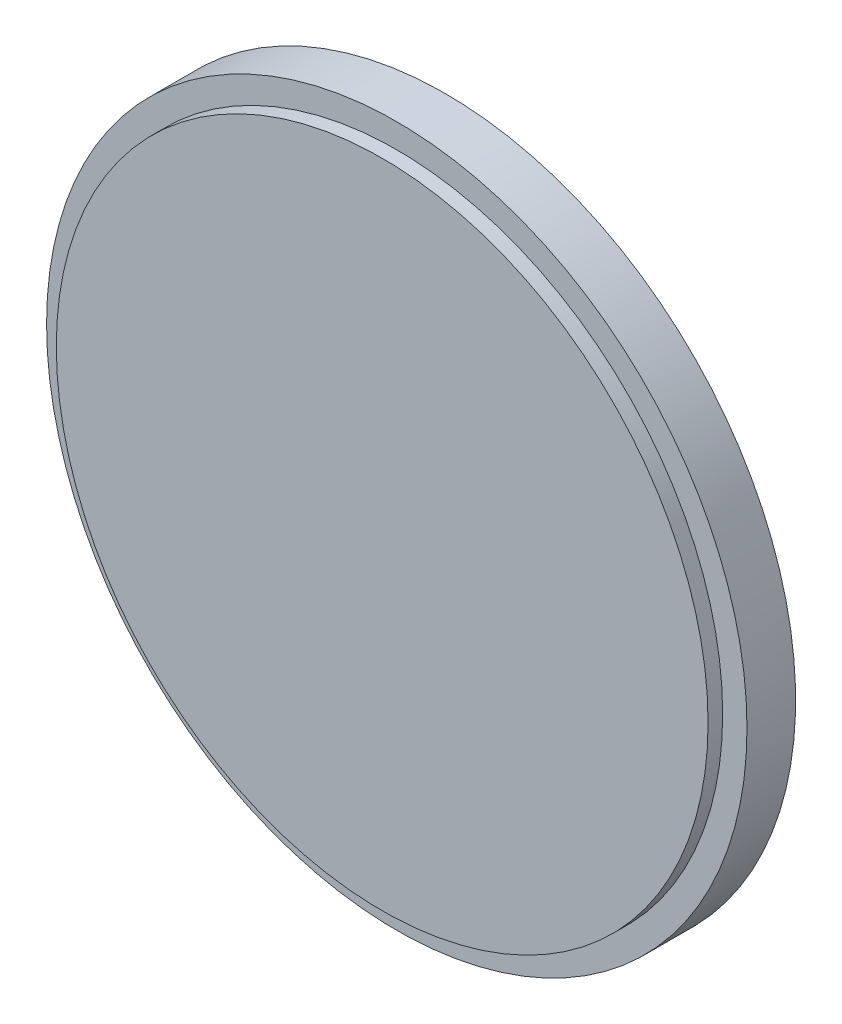
ISO-10303-21;
HEADER;
FILE_DESCRIPTION(('STEP AP214'),'2;1');
FILE_NAME('part.step','',(''),(''),'','','');
FILE_SCHEMA(('AUTOMOTIVE_DESIGN { 1 0 10303 214 1 1 1 1 }'));
ENDSEC;
DATA;
#1=APPLICATION_CONTEXT('core data for automotive mechanical design processes');
#2=APPLICATION_PROTOCOL_DEFINITION('international standard','automotive_design',2000,#1);
#3=PRODUCT_CONTEXT('',#1,'mechanical');
#4=PRODUCT('Part','Part','',(#3));
#5=PRODUCT_RELATED_PRODUCT_CATEGORY('part','',(#4));
#6=PRODUCT_DEFINITION_FORMATION('','',#4);
#7=PRODUCT_DEFINITION_CONTEXT('part definition',#1,'design');
#8=PRODUCT_DEFINITION('design','',#6,#7);
#9=PRODUCT_DEFINITION_SHAPE('','',#8);
#10=(LENGTH_UNIT() NAMED_UNIT(*) SI_UNIT(.MILLI.,.METRE.));
#11=(NAMED_UNIT(*) PLANE_ANGLE_UNIT() SI_UNIT($,.RADIAN.));
#12=(NAMED_UNIT(*) SI_UNIT($,.STERADIAN.) SOLID_ANGLE_UNIT());
#13=UNCERTAINTY_MEASURE_WITH_UNIT(LENGTH_MEASURE(1.E-05),#10,'distance_accuracy_value','');
#14=(GEOMETRIC_REPRESENTATION_CONTEXT(3) GLOBAL_UNCERTAINTY_ASSIGNED_CONTEXT((#13)) GLOBAL_UNIT_ASSIGNED_CONTEXT((#10,
#11,#12)) REPRESENTATION_CONTEXT('',''));
#15=CARTESIAN_POINT('',(0.,0.,0.));
#16=DIRECTION('',(0.,0.,1.));
#17=DIRECTION('',(1.,0.,0.));
#18=AXIS2_PLACEMENT_3D('',#15,#16,#17);
#19=CARTESIAN_POINT('',(0.,0.,0.));
#20=DIRECTION('',(0.,0.,-1.));
#21=DIRECTION('',(-1.,0.,0.));
#22=AXIS2_PLACEMENT_3D('',#19,#20,#21);
#23=CYLINDRICAL_SURFACE('',#22,1.65);
#24=DIRECTION('',(0.,0.,-1.));
#25=VECTOR('',#24,1.);
#26=CARTESIAN_POINT('',(-1.22983738762488,1.1,0.));
#27=LINE('',#26,#25);
#28=CARTESIAN_POINT('',(-1.22983738762488,1.1,-8.67414363469547));
#29=VERTEX_POINT('',#28);
#30=CARTESIAN_POINT('',(-1.22983738762488,1.1,-11.));
#31=VERTEX_POINT('',#30);
#32=EDGE_CURVE('E93',#29,#31,#27,.T.);
#33=ORIENTED_EDGE('',*,*,#32,.F.);
#34=CARTESIAN_POINT('',(-1.22983738762488,1.1,-8.67414363469547));
#35=CARTESIAN_POINT('',(-1.25972267770271,1.06657468285451,-8.65400140403858));
#36=CARTESIAN_POINT('',(-1.2882164500901,1.03198817515102,-8.63371639752812));
#37=CARTESIAN_POINT('',(-1.34237621084832,0.960493262433783,-8.59331950486891));
#38=CARTESIAN_POINT('',(-1.3680386895312,0.923582062762849,-8.57320786145536));
#39=CARTESIAN_POINT('',(-1.41674056297546,0.84701241880221,-8.5334040492105));
#40=CARTESIAN_POINT('',(-1.43974034049799,0.807323863660248,-8.51372107206718));
#41=CARTESIAN_POINT('',(-1.48256092162577,0.725697771452141,-8.47567938063038));
#42=CARTESIAN_POINT('',(-1.50238345304045,0.683761473396036,-8.45731994959245));
#43=CARTESIAN_POINT('',(-1.5472691760861,0.577232965481057,-8.41439211184499));
#44=CARTESIAN_POINT('',(-1.57037612270089,0.511307129973477,-8.39099456375916));
#45=CARTESIAN_POINT('',(-1.60828546831877,0.37532171075534,-8.35139108135665));
#46=CARTESIAN_POINT('',(-1.62312780280254,0.305283845813563,-8.33515064401284));
#47=CARTESIAN_POINT('',(-1.64372395591521,0.16127800192553,-8.31233643182032));
#48=CARTESIAN_POINT('',(-1.64935750847357,0.0872708555073534,-8.30589064973981));
#49=CARTESIAN_POINT('',(-1.65053754719034,-0.0609531668715777,-8.30455478391828));
#50=CARTESIAN_POINT('',(-1.64608287017167,-0.135170066031502,-8.30966603270764));
#51=CARTESIAN_POINT('',(-1.62904834866139,-0.269354255413211,-8.32862042054279));
#52=CARTESIAN_POINT('',(-1.61785207405163,-0.329731150995088,-8.34096871124797));
#53=CARTESIAN_POINT('',(-1.58930666728508,-0.447528660137509,-8.37136141854806));
#54=CARTESIAN_POINT('',(-1.57195078616389,-0.504945951570416,-8.38941208073063));
#55=CARTESIAN_POINT('',(-1.51981112380505,-0.649282675864939,-8.44128661621104));
#56=CARTESIAN_POINT('',(-1.48078961155974,-0.733582130426046,-8.47812756257792));
#57=CARTESIAN_POINT('',(-1.39037928017929,-0.893190532483568,-8.55599740198226));
#58=CARTESIAN_POINT('',(-1.33896184092909,-0.968478062021212,-8.59703585824725));
#59=CARTESIAN_POINT('',(-1.22287267734106,-1.1116685700627,-8.68025476696594));
#60=CARTESIAN_POINT('',(-1.15786677869635,-1.17930197847097,-8.72243464117089));
#61=CARTESIAN_POINT('',(-1.01606582055608,-1.3034418921011,-8.80300874565532));
#62=CARTESIAN_POINT('',(-0.939290596963742,-1.3599667604018,-8.84140917021824));
#63=CARTESIAN_POINT('',(-0.789073764155508,-1.45126789157716,-8.90494694511223));
#64=CARTESIAN_POINT('',(-0.717383559064625,-1.48811768180286,-8.93122942565062));
#65=CARTESIAN_POINT('',(-0.567505115457208,-1.55146470867889,-8.97698410392863));
#66=CARTESIAN_POINT('',(-0.489320686427698,-1.57796796327856,-8.99646025979951));
#67=CARTESIAN_POINT('',(-0.327709962082995,-1.61929041342061,-9.02701763496249));
#68=CARTESIAN_POINT('',(-0.244251987928246,-1.634029940681,-9.03804159343875));
#69=CARTESIAN_POINT('',(-0.0753585849575415,-1.65045618297154,-9.05033499698802));
#70=CARTESIAN_POINT('',(0.0100756992051538,-1.6521502728514,-9.05160995336631));
#71=CARTESIAN_POINT('',(0.170253339593169,-1.64293207202227,-9.04470290043584));
#72=CARTESIAN_POINT('',(0.245128040339948,-1.63340221205291,-9.03755790250606));
#73=CARTESIAN_POINT('',(0.391879942106289,-1.60453244308618,-9.01608664328517));
#74=CARTESIAN_POINT('',(0.463756612429009,-1.5851908051639,-9.00175911637209));
#75=CARTESIAN_POINT('',(0.604442375314429,-1.53714066152403,-8.96660751097491));
#76=CARTESIAN_POINT('',(0.673149271858587,-1.50823555407053,-8.94564751727729));
#77=CARTESIAN_POINT('',(0.804690367902077,-1.44235591231456,-8.8987450801489));
#78=CARTESIAN_POINT('',(0.867523630455517,-1.40538009372112,-8.87280184381444));
#79=CARTESIAN_POINT('',(0.996309669760407,-1.31790100166509,-8.81295222346145));
#80=CARTESIAN_POINT('',(1.06114856394579,-1.26617947296784,-8.77843597356108));
#81=CARTESIAN_POINT('',(1.18180746475075,-1.15438829016984,-8.70695017555489));
#82=CARTESIAN_POINT('',(1.23760957960267,-1.09430250259961,-8.66997596016618));
#83=CARTESIAN_POINT('',(1.34973908910441,-0.954083951537922,-8.58892434363585));
#84=CARTESIAN_POINT('',(1.4040577372899,-0.872325096744643,-8.54486408417523));
#85=CARTESIAN_POINT('',(1.4981930779484,-0.698324563643964,-8.46224043130541));
#86=CARTESIAN_POINT('',(1.53804158223777,-0.606106472827377,-8.42366509468487));
#87=CARTESIAN_POINT('',(1.58933503393235,-0.447914995946644,-8.37145604288562));
#88=CARTESIAN_POINT('',(1.60583285811042,-0.384899799349373,-8.35387870733763));
#89=CARTESIAN_POINT('',(1.63136286756014,-0.255852810868967,-8.32614877726118));
#90=CARTESIAN_POINT('',(1.64041249718908,-0.189828452047195,-8.31597884039241));
#91=CARTESIAN_POINT('',(1.65042666865869,-0.0558902341369621,-8.30470219606004));
#92=CARTESIAN_POINT('',(1.65133479317434,0.0120335428020966,-8.30365873256452));
#93=CARTESIAN_POINT('',(1.64483217516017,0.146973788300026,-8.31100819652258));
#94=CARTESIAN_POINT('',(1.63741520623648,0.213989539779551,-8.31940818680678));
#95=CARTESIAN_POINT('',(1.61309135588696,0.355501334757847,-8.34609535114535));
#96=CARTESIAN_POINT('',(1.5948693685621,0.429504639559172,-8.3657358701901));
#97=CARTESIAN_POINT('',(1.5493396887642,0.572468262653248,-8.41224225544382));
#98=CARTESIAN_POINT('',(1.52199180907575,0.641404599646636,-8.43913997769595));
#99=CARTESIAN_POINT('',(1.45611538254922,0.780189447058983,-8.49982507259302));
#100=CARTESIAN_POINT('',(1.41674853168308,0.849453821409272,-8.53403074792977));
#101=CARTESIAN_POINT('',(1.35122656450678,0.947741528003057,-8.58636481834102));
#102=CARTESIAN_POINT('',(1.32844703529147,0.979413503045018,-8.60388338383029));
#103=CARTESIAN_POINT('',(1.28074395596679,1.04101278301063,-8.63901407129565));
#104=CARTESIAN_POINT('',(1.25582154643641,1.0709410020153,-8.65662613887704));
#105=CARTESIAN_POINT('',(1.22983738762488,1.1,-8.67414363469547));
#106=B_SPLINE_CURVE_WITH_KNOTS('',3,(#34,#35,#36,#37,#38,#39,#40,#41,#42,#43,#44,#45,#46,#47,
#48,#49,#50,#51,#52,#53,#54,#55,#56,#57,#58,#59,#60,#61,#62,#63,#64,#65,#66,#67,#68,#69,#70,#71,
#72,#73,#74,#75,#76,#77,#78,#79,#80,#81,#82,#83,#84,#85,#86,#87,#88,#89,#90,#91,#92,#93,#94,#95,
#96,#97,#98,#99,#100,#101,#102,#103,#104,#105),.UNSPECIFIED.,.F.,.F.,(4,2,2,2,2,2,2,2,2,2,2,2,2,
2,2,2,2,2,2,2,2,2,2,2,2,2,2,2,2,2,2,2,2,2,2,4),(0.,0.147430706747664,0.29504216335986,
0.444625367837822,0.594126949863428,0.81434501708278,1.03348952225696,1.25547381549451,
1.47748370491671,1.66468198055187,1.85208600226789,2.15025056286029,2.44911024165853,
2.75643509723401,3.06324757244658,3.31658284014988,3.56977053784193,3.82465870133456,
4.07940276080496,4.30578700645853,4.53221115694737,4.76361376718509,4.99505322736367,
5.26358388817572,5.53263987471877,5.85402604937325,6.17470133429575,6.37639100175707,
6.57760693832056,6.780216150931,6.98297699737486,7.21779837480066,7.45366777754985,
7.71286594762324,7.84109114847913,7.96924851718071),.UNSPECIFIED.);
#107=CARTESIAN_POINT('',(1.22983738762488,1.1,-8.67414363469547));
#108=VERTEX_POINT('',#107);
#109=EDGE_CURVE('E53',#29,#108,#106,.T.);
#110=ORIENTED_EDGE('',*,*,#109,.T.);
#111=DIRECTION('',(0.,0.,-1.));
#112=VECTOR('',#111,1.);
#113=CARTESIAN_POINT('',(1.22983738762488,1.1,0.));
#114=LINE('',#113,#112);
#115=CARTESIAN_POINT('',(1.22983738762488,1.1,-11.));
#116=VERTEX_POINT('',#115);
#117=EDGE_CURVE('E92',#108,#116,#114,.T.);
#118=ORIENTED_EDGE('',*,*,#117,.T.);
#119=CARTESIAN_POINT('',(0.,0.,-11.));
#120=DIRECTION('',(0.,0.,-1.));
#121=DIRECTION('',(-1.,0.,0.));
#122=AXIS2_PLACEMENT_3D('',#119,#120,#121);
#123=CIRCLE('',#122,1.65);
#124=EDGE_CURVE('E253',#116,#31,#123,.T.);
#125=ORIENTED_EDGE('',*,*,#124,.T.);
#126=EDGE_LOOP('',(#33,#110,#118,#125));
#127=FACE_BOUND('',#126,.T.);
#128=ADVANCED_FACE('F39',(#127),#23,.F.);
#129=CARTESIAN_POINT('',(1.22983738762488,1.1,0.));
#130=DIRECTION('',(0.,1.,0.));
#131=DIRECTION('',(0.,0.,1.));
#132=AXIS2_PLACEMENT_3D('',#129,#130,#131);
#133=PLANE('',#132);
#134=ORIENTED_EDGE('',*,*,#117,.F.);
#135=CARTESIAN_POINT('',(0.,1.1,-6.85));
#136=DIRECTION('',(0.,1.,0.));
#137=DIRECTION('',(0.,0.,1.));
#138=AXIS2_PLACEMENT_3D('',#135,#136,#137);
#139=CIRCLE('',#138,2.2);
#140=EDGE_CURVE('E11',#108,#29,#139,.T.);
#141=ORIENTED_EDGE('',*,*,#140,.T.);
#142=ORIENTED_EDGE('',*,*,#32,.T.);
#143=DIRECTION('',(1.,0.,0.));
#144=VECTOR('',#143,1.);
#145=CARTESIAN_POINT('',(1.22983738762488,1.1,-11.));
#146=LINE('',#145,#144);
#147=EDGE_CURVE('E255',#31,#116,#146,.T.);
#148=ORIENTED_EDGE('',*,*,#147,.T.);
#149=EDGE_LOOP('',(#134,#141,#142,#148));
#150=FACE_BOUND('',#149,.T.);
#151=ADVANCED_FACE('F151',(#150),#133,.F.);
#152=CARTESIAN_POINT('',(0.,0.,1.5));
#153=DIRECTION('',(0.,0.,-1.));
#154=DIRECTION('',(-1.,0.,0.));
#155=AXIS2_PLACEMENT_3D('',#152,#153,#154);
#156=PLANE('',#155);
#157=CARTESIAN_POINT('',(0.,0.,1.5));
#158=DIRECTION('',(0.,0.,-1.));
#159=DIRECTION('',(-1.,0.,0.));
#160=AXIS2_PLACEMENT_3D('',#157,#158,#159);
#161=CIRCLE('',#160,33.5);
#162=CARTESIAN_POINT('',(-33.5,0.,1.5));
#163=VERTEX_POINT('',#162);
#164=EDGE_CURVE('E111',#163,#163,#161,.T.);
#165=ORIENTED_EDGE('',*,*,#164,.F.);
#166=EDGE_LOOP('',(#165));
#167=FACE_BOUND('',#166,.T.);
#168=CARTESIAN_POINT('',(0.,0.,1.5));
#169=DIRECTION('',(0.,0.,-1.));
#170=DIRECTION('',(-1.,0.,0.));
#171=AXIS2_PLACEMENT_3D('',#168,#169,#170);
#172=CIRCLE('',#171,36.);
#173=CARTESIAN_POINT('',(-36.,0.,1.5));
#174=VERTEX_POINT('',#173);
#175=EDGE_CURVE('E98',#174,#174,#172,.T.);
#176=ORIENTED_EDGE('',*,*,#175,.T.);
#177=EDGE_LOOP('',(#176));
#178=FACE_BOUND('',#177,.T.);
#179=ADVANCED_FACE('F158',(#167,#178),#156,.T.);
#180=CARTESIAN_POINT('',(0.,0.,0.));
#181=DIRECTION('',(0.,0.,1.));
#182=DIRECTION('',(1.,0.,0.));
#183=AXIS2_PLACEMENT_3D('',#180,#181,#182);
#184=PLANE('',#183);
#185=CARTESIAN_POINT('',(0.,0.,0.));
#186=DIRECTION('',(0.,0.,1.));
#187=DIRECTION('',(1.,0.,0.));
#188=AXIS2_PLACEMENT_3D('',#185,#186,#187);
#189=CIRCLE('',#188,32.5);
#190=CARTESIAN_POINT('',(32.5,0.,0.));
#191=VERTEX_POINT('',#190);
#192=EDGE_CURVE('E125',#191,#191,#189,.T.);
#193=ORIENTED_EDGE('',*,*,#192,.T.);
#194=EDGE_LOOP('',(#193));
#195=FACE_BOUND('',#194,.T.);
#196=CARTESIAN_POINT('',(0.,0.,0.));
#197=DIRECTION('',(0.,0.,-1.));
#198=DIRECTION('',(-1.,0.,0.));
#199=AXIS2_PLACEMENT_3D('',#196,#197,#198);
#200=CIRCLE('',#199,33.5);
#201=CARTESIAN_POINT('',(-33.5,0.,0.));
#202=VERTEX_POINT('',#201);
#203=EDGE_CURVE('E110',#202,#202,#200,.T.);
#204=ORIENTED_EDGE('',*,*,#203,.T.);
#205=EDGE_LOOP('',(#204));
#206=FACE_BOUND('',#205,.T.);
#207=ADVANCED_FACE('F41',(#195,#206),#184,.F.);
#208=CARTESIAN_POINT('',(0.,0.,8.));
#209=DIRECTION('',(0.,0.,-1.));
#210=DIRECTION('',(-1.,0.,0.));
#211=AXIS2_PLACEMENT_3D('',#208,#209,#210);
#212=CYLINDRICAL_SURFACE('',#211,32.5);
#213=ORIENTED_EDGE('',*,*,#192,.F.);
#214=EDGE_LOOP('',(#213));
#215=FACE_BOUND('',#214,.T.);
#216=CARTESIAN_POINT('',(0.,0.,5.));
#217=DIRECTION('',(0.,0.,1.));
#218=DIRECTION('',(1.,0.,0.));
#219=AXIS2_PLACEMENT_3D('',#216,#217,#218);
#220=CIRCLE('',#219,32.5);
#221=CARTESIAN_POINT('',(32.5,0.,5.));
#222=VERTEX_POINT('',#221);
#223=EDGE_CURVE('E120',#222,#222,#220,.T.);
#224=ORIENTED_EDGE('',*,*,#223,.T.);
#225=EDGE_LOOP('',(#224));
#226=FACE_BOUND('',#225,.T.);
#227=ADVANCED_FACE('F224',(#215,#226),#212,.F.);
#228=CARTESIAN_POINT('',(0.,0.,5.));
#229=DIRECTION('',(0.,0.,1.));
#230=DIRECTION('',(1.,0.,0.));
#231=AXIS2_PLACEMENT_3D('',#228,#229,#230);
#232=PLANE('',#231);
#233=CARTESIAN_POINT('',(0.,0.,5.));
#234=DIRECTION('',(0.,0.,1.));
#235=DIRECTION('',(1.,0.,0.));
#236=AXIS2_PLACEMENT_3D('',#233,#234,#235);
#237=CIRCLE('',#236,10.);
#238=CARTESIAN_POINT('',(10.,0.,5.));
#239=VERTEX_POINT('',#238);
#240=EDGE_CURVE('E128',#239,#239,#237,.F.);
#241=ORIENTED_EDGE('',*,*,#240,.F.);
#242=EDGE_LOOP('',(#241));
#243=FACE_BOUND('',#242,.T.);
#244=ORIENTED_EDGE('',*,*,#223,.F.);
#245=EDGE_LOOP('',(#244));
#246=FACE_BOUND('',#245,.T.);
#247=ADVANCED_FACE('F209',(#243,#246),#232,.F.);
#248=CARTESIAN_POINT('',(0.,0.,1.5));
#249=DIRECTION('',(0.,0.,-1.));
#250=DIRECTION('',(-1.,0.,0.));
#251=AXIS2_PLACEMENT_3D('',#248,#249,#250);
#252=CYLINDRICAL_SURFACE('',#251,33.5);
#253=ORIENTED_EDGE('',*,*,#164,.T.);
#254=EDGE_LOOP('',(#253));
#255=FACE_BOUND('',#254,.T.);
#256=ORIENTED_EDGE('',*,*,#203,.F.);
#257=EDGE_LOOP('',(#256));
#258=FACE_BOUND('',#257,.T.);
#259=ADVANCED_FACE('F204',(#255,#258),#252,.T.);
#260=CARTESIAN_POINT('',(0.,0.,-11.));
#261=DIRECTION('',(0.,0.,1.));
#262=DIRECTION('',(1.,0.,0.));
#263=AXIS2_PLACEMENT_3D('',#260,#261,#262);
#264=CYLINDRICAL_SURFACE('',#263,10.);
#265=CARTESIAN_POINT('',(-2.2,-9.75499871860576,-6.85));
#266=CARTESIAN_POINT('',(-2.19999582985001,-9.75500118343098,-6.72804035884628));
#267=CARTESIAN_POINT('',(-2.18982403731247,-9.75731079100817,-6.60603075615576));
#268=CARTESIAN_POINT('',(-2.14945092595785,-9.76628244309111,-6.36548258057534));
#269=CARTESIAN_POINT('',(-2.11923523542218,-9.77294761053513,-6.24694656201175));
#270=CARTESIAN_POINT('',(-2.03977285771041,-9.78983981120235,-6.01685996121709));
#271=CARTESIAN_POINT('',(-1.9905471918907,-9.80006290881353,-5.90530182058323));
#272=CARTESIAN_POINT('',(-1.87452251455576,-9.82291434151705,-5.69202460414284));
#273=CARTESIAN_POINT('',(-1.80772382176928,-9.83554263298433,-5.59030534993039));
#274=CARTESIAN_POINT('',(-1.65723245142519,-9.8620226708364,-5.39785367898436));
#275=CARTESIAN_POINT('',(-1.57329618650844,-9.875890221968,-5.30731388132283));
#276=CARTESIAN_POINT('',(-1.3914381089065,-9.90314793868655,-5.14147856488675));
#277=CARTESIAN_POINT('',(-1.293515202231,-9.91653806682853,-5.06618423967896));
#278=CARTESIAN_POINT('',(-1.08517100314848,-9.94150445503394,-4.93221427132276));
#279=CARTESIAN_POINT('',(-0.974627774835852,-9.95305989181124,-4.87372404304363));
#280=CARTESIAN_POINT('',(-0.744984431647961,-9.97287631874014,-4.77622239430056));
#281=CARTESIAN_POINT('',(-0.625885290131685,-9.98113768294194,-4.73720876209346));
#282=CARTESIAN_POINT('',(-0.384513904340658,-9.99332344540942,-4.68037400074853));
#283=CARTESIAN_POINT('',(-0.262321853398403,-9.99731449698633,-4.66222683107875));
#284=CARTESIAN_POINT('',(-0.0165668821506721,-10.0007409353559,-4.64662057831249));
#285=CARTESIAN_POINT('',(0.106995877918008,-10.0001768491578,-4.64915910197317));
#286=CARTESIAN_POINT('',(0.349736623620102,-9.99460745843333,-4.67460966706032));
#287=CARTESIAN_POINT('',(0.468953474341125,-9.98967876944447,-4.6971702591271));
#288=CARTESIAN_POINT('',(0.70186647170252,-9.97602133489624,-4.76146431754959));
#289=CARTESIAN_POINT('',(0.815562366558124,-9.9672924162069,-4.80319865742324));
#290=CARTESIAN_POINT('',(1.03517975330623,-9.9468923386388,-4.90496537086359));
#291=CARTESIAN_POINT('',(1.14103760404009,-9.93519991951387,-4.96513064870554));
#292=CARTESIAN_POINT('',(1.34128247253618,-9.91015437424708,-5.10195219856208));
#293=CARTESIAN_POINT('',(1.43566790782171,-9.8968010195127,-5.17861074158631));
#294=CARTESIAN_POINT('',(1.61237917492999,-9.8695697406224,-5.34815504063947));
#295=CARTESIAN_POINT('',(1.69440937423111,-9.85568669108064,-5.44134837578444));
#296=CARTESIAN_POINT('',(1.84173250723206,-9.82922378882484,-5.64031234250195));
#297=CARTESIAN_POINT('',(1.90702497646609,-9.81664397228081,-5.74608332298029));
#298=CARTESIAN_POINT('',(2.01915278938798,-9.79419813809877,-5.96768197981997));
#299=CARTESIAN_POINT('',(2.06593168059472,-9.78434044810238,-6.08353912090938));
#300=CARTESIAN_POINT('',(2.13926669456258,-9.76856999155085,-6.32173827272977));
#301=CARTESIAN_POINT('',(2.16582606675232,-9.76265659113765,-6.44407923807986));
#302=CARTESIAN_POINT('',(2.19750834426518,-9.75557367749228,-6.68907035628535));
#303=CARTESIAN_POINT('',(2.20306196865663,-9.75430886141666,-6.81166211839551));
#304=CARTESIAN_POINT('',(2.19374172960032,-9.75640914933246,-7.05601984027404));
#305=CARTESIAN_POINT('',(2.17886928717229,-9.75977393124769,-7.17778585689642));
#306=CARTESIAN_POINT('',(2.12949294885839,-9.77066424141723,-7.41553205883359));
#307=CARTESIAN_POINT('',(2.09522680176913,-9.77813934987961,-7.53156414407545));
#308=CARTESIAN_POINT('',(2.00829340486575,-9.79636248106968,-7.75623997307675));
#309=CARTESIAN_POINT('',(1.95562437685934,-9.80711082006285,-7.86488300165065));
#310=CARTESIAN_POINT('',(1.83243318062886,-9.83087839533852,-8.07355919215617));
#311=CARTESIAN_POINT('',(1.76164598139759,-9.84393036303466,-8.17343208945765));
#312=CARTESIAN_POINT('',(1.60457416825332,-9.8707484805376,-8.36003961588255));
#313=CARTESIAN_POINT('',(1.51828760620634,-9.88451471996723,-8.44677259090384));
#314=CARTESIAN_POINT('',(1.33071627964768,-9.91152476620641,-8.60631286026432));
#315=CARTESIAN_POINT('',(1.22917911490755,-9.92475380321577,-8.67882633401546));
#316=CARTESIAN_POINT('',(1.01511471576615,-9.94892590657074,-8.8057668015618));
#317=CARTESIAN_POINT('',(0.90258799810698,-9.95986908032452,-8.86019464523593));
#318=CARTESIAN_POINT('',(0.670443856281928,-9.97817424190924,-8.94901105254362));
#319=CARTESIAN_POINT('',(0.550877196125642,-9.98555901299672,-8.98352739145721));
#320=CARTESIAN_POINT('',(0.307461489543244,-9.99601386568801,-9.03193952443697));
#321=CARTESIAN_POINT('',(0.183613076065377,-9.99908458224436,-9.04583835305284));
#322=CARTESIAN_POINT('',(-0.0620623968224949,-10.0005462144543,-9.05248315967008));
#323=CARTESIAN_POINT('',(-0.183877225652458,-9.99903414019878,-9.04566761796823));
#324=CARTESIAN_POINT('',(-0.424579918065631,-9.99170821481959,-9.01205884250173));
#325=CARTESIAN_POINT('',(-0.543467835420546,-9.9858944427855,-8.98526597603352));
#326=CARTESIAN_POINT('',(-0.774598137758804,-9.97062584889604,-8.9126742605439));
#327=CARTESIAN_POINT('',(-0.886861110708086,-9.96118307593843,-8.86693826726559));
#328=CARTESIAN_POINT('',(-1.10217776083775,-9.93966425210757,-8.75781960657127));
#329=CARTESIAN_POINT('',(-1.20523053155632,-9.92758794244493,-8.69443520473187));
#330=CARTESIAN_POINT('',(-1.40133809510356,-9.90182969912891,-8.55039276458109));
#331=CARTESIAN_POINT('',(-1.49416325728113,-9.88812141549234,-8.46942677873897));
#332=CARTESIAN_POINT('',(-1.66505913407459,-9.86078523502679,-8.29313977284372));
#333=CARTESIAN_POINT('',(-1.74312628129569,-9.84715735840357,-8.19781529195024));
#334=CARTESIAN_POINT('',(-1.88331094510882,-9.82131879900445,-7.99396235714238));
#335=CARTESIAN_POINT('',(-1.94519778906214,-9.80912984325456,-7.88527236081825));
#336=CARTESIAN_POINT('',(-2.04972863189161,-9.78782305384745,-7.65878916941697));
#337=CARTESIAN_POINT('',(-2.09238883144267,-9.77870263624046,-7.54100373670625));
#338=CARTESIAN_POINT('',(-2.14968682586141,-9.76624200003064,-7.32759146473857));
#339=CARTESIAN_POINT('',(-2.16851790141074,-9.76205389052243,-7.23311759290545));
#340=CARTESIAN_POINT('',(-2.1936758219439,-9.75643134601218,-7.04243945902184));
#341=CARTESIAN_POINT('',(-2.2000032905604,-9.75499677367421,-6.94623528351388));
#342=CARTESIAN_POINT('',(-2.2,-9.75499871860576,-6.85));
#343=B_SPLINE_CURVE_WITH_KNOTS('',3,(#265,#266,#267,#268,#269,#270,#271,#272,#273,#274,#275,
#276,#277,#278,#279,#280,#281,#282,#283,#284,#285,#286,#287,#288,#289,#290,#291,#292,#293,#294,
#295,#296,#297,#298,#299,#300,#301,#302,#303,#304,#305,#306,#307,#308,#309,#310,#311,#312,#313,
#314,#315,#316,#317,#318,#319,#320,#321,#322,#323,#324,#325,#326,#327,#328,#329,#330,#331,#332,
#333,#334,#335,#336,#337,#338,#339,#340,#341,#342),.UNSPECIFIED.,.T.,.F.,(4,2,2,2,2,2,2,2,2,2,2,
2,2,2,2,2,2,2,2,2,2,2,2,2,2,2,2,2,2,2,2,2,2,2,2,2,2,2,4),(0.,0.365526202215563,
0.731314774856606,1.09670000899312,1.46207861645421,1.83306588321281,2.20408218331303,
2.57904748249966,2.95397019130306,3.32295149377426,3.69189010735349,4.05447803874404,
4.41708249056042,4.78236578959901,5.14769941787192,5.52072230380363,5.89375553986191,
6.26791764092282,6.64201959862216,7.00840772564062,7.37477036471775,7.73673610733307,
8.09873683483866,8.46637002649498,8.83404945879431,9.2086704091441,9.58327375283624,
9.95544567166843,10.3275628076359,10.6918582505282,11.0561469957711,11.4192365463872,
11.7823617927669,12.1524507184784,12.5226289902046,12.8978277226305,13.2727097128703,
13.5611516267101,13.8495791537937),.UNSPECIFIED.);
#344=CARTESIAN_POINT('',(-2.2,-9.75499871860576,-6.85));
#345=VERTEX_POINT('',#344);
#346=EDGE_CURVE('E194',#345,#345,#343,.T.);
#347=ORIENTED_EDGE('',*,*,#346,.T.);
#348=EDGE_LOOP('',(#347));
#349=FACE_BOUND('',#348,.T.);
#350=CARTESIAN_POINT('',(-2.2,9.75499871860576,-6.85));
#351=CARTESIAN_POINT('',(-2.19999582985001,9.75500118343098,-6.97195964115372));
#352=CARTESIAN_POINT('',(-2.18982403731247,9.75731079100817,-7.09396924384424));
#353=CARTESIAN_POINT('',(-2.14945092595785,9.76628244309111,-7.33451741942466));
#354=CARTESIAN_POINT('',(-2.11923523542218,9.77294761053513,-7.45305343798825));
#355=CARTESIAN_POINT('',(-2.03977285771042,9.78983981120235,-7.68314003878291));
#356=CARTESIAN_POINT('',(-1.9905471918907,9.80006290881353,-7.79469817941676));
#357=CARTESIAN_POINT('',(-1.87452251455576,9.82291434151705,-8.00797539585716));
#358=CARTESIAN_POINT('',(-1.80772382176928,9.83554263298432,-8.10969465006961));
#359=CARTESIAN_POINT('',(-1.65723245142519,9.8620226708364,-8.30214632101564));
#360=CARTESIAN_POINT('',(-1.57329618650844,9.875890221968,-8.39268611867717));
#361=CARTESIAN_POINT('',(-1.3914381089065,9.90314793868655,-8.55852143511325));
#362=CARTESIAN_POINT('',(-1.293515202231,9.91653806682853,-8.63381576032103));
#363=CARTESIAN_POINT('',(-1.08517100314848,9.94150445503394,-8.76778572867724));
#364=CARTESIAN_POINT('',(-0.974627774835854,9.95305989181124,-8.82627595695636));
#365=CARTESIAN_POINT('',(-0.744984431647963,9.97287631874014,-8.92377760569943));
#366=CARTESIAN_POINT('',(-0.625885290131687,9.98113768294194,-8.96279123790653));
#367=CARTESIAN_POINT('',(-0.38451390434066,9.99332344540942,-9.01962599925147));
#368=CARTESIAN_POINT('',(-0.262321853398405,9.99731449698633,-9.03777316892125));
#369=CARTESIAN_POINT('',(-0.0165668821506736,10.0007409353559,-9.0533794216875));
#370=CARTESIAN_POINT('',(0.106995877918007,10.0001768491578,-9.05084089802683));
#371=CARTESIAN_POINT('',(0.3497366236201,9.99460745843333,-9.02539033293968));
#372=CARTESIAN_POINT('',(0.468953474341123,9.98967876944447,-9.0028297408729));
#373=CARTESIAN_POINT('',(0.701866471702519,9.97602133489624,-8.93853568245041));
#374=CARTESIAN_POINT('',(0.815562366558122,9.9672924162069,-8.89680134257675));
#375=CARTESIAN_POINT('',(1.03517975330623,9.9468923386388,-8.79503462913641));
#376=CARTESIAN_POINT('',(1.14103760404009,9.93519991951387,-8.73486935129445));
#377=CARTESIAN_POINT('',(1.34128247253617,9.91015437424708,-8.59804780143792));
#378=CARTESIAN_POINT('',(1.43566790782171,9.8968010195127,-8.52138925841369));
#379=CARTESIAN_POINT('',(1.61237917492999,9.8695697406224,-8.35184495936053));
#380=CARTESIAN_POINT('',(1.69440937423111,9.85568669108064,-8.25865162421556));
#381=CARTESIAN_POINT('',(1.84173250723206,9.82922378882484,-8.05968765749805));
#382=CARTESIAN_POINT('',(1.90702497646609,9.81664397228081,-7.95391667701971));
#383=CARTESIAN_POINT('',(2.01915278938798,9.79419813809877,-7.73231802018002));
#384=CARTESIAN_POINT('',(2.06593168059472,9.78434044810239,-7.61646087909062));
#385=CARTESIAN_POINT('',(2.13926669456258,9.76856999155085,-7.37826172727022));
#386=CARTESIAN_POINT('',(2.16582606675232,9.76265659113765,-7.25592076192013));
#387=CARTESIAN_POINT('',(2.19750834426517,9.75557367749228,-7.01092964371465));
#388=CARTESIAN_POINT('',(2.20306196865663,9.75430886141666,-6.88833788160449));
#389=CARTESIAN_POINT('',(2.19374172960031,9.75640914933246,-6.64398015972596));
#390=CARTESIAN_POINT('',(2.17886928717229,9.75977393124769,-6.52221414310358));
#391=CARTESIAN_POINT('',(2.12949294885839,9.77066424141723,-6.2844679411664));
#392=CARTESIAN_POINT('',(2.09522680176913,9.77813934987961,-6.16843585592455));
#393=CARTESIAN_POINT('',(2.00829340486575,9.79636248106968,-5.94376002692325));
#394=CARTESIAN_POINT('',(1.95562437685933,9.80711082006285,-5.83511699834934));
#395=CARTESIAN_POINT('',(1.83243318062886,9.83087839533852,-5.62644080784383));
#396=CARTESIAN_POINT('',(1.76164598139758,9.84393036303466,-5.52656791054234));
#397=CARTESIAN_POINT('',(1.60457416825331,9.8707484805376,-5.33996038411745));
#398=CARTESIAN_POINT('',(1.51828760620634,9.88451471996723,-5.25322740909616));
#399=CARTESIAN_POINT('',(1.33071627964768,9.91152476620641,-5.09368713973568));
#400=CARTESIAN_POINT('',(1.22917911490755,9.92475380321578,-5.02117366598453));
#401=CARTESIAN_POINT('',(1.01511471576615,9.94892590657074,-4.8942331984382));
#402=CARTESIAN_POINT('',(0.902587998106977,9.95986908032452,-4.83980535476407));
#403=CARTESIAN_POINT('',(0.670443856281926,9.97817424190924,-4.75098894745638));
#404=CARTESIAN_POINT('',(0.55087719612564,9.98555901299672,-4.71647260854279));
#405=CARTESIAN_POINT('',(0.307461489543241,9.99601386568801,-4.66806047556303));
#406=CARTESIAN_POINT('',(0.183613076065375,9.99908458224436,-4.65416164694716));
#407=CARTESIAN_POINT('',(-0.0620623968224976,10.0005462144543,-4.64751684032992));
#408=CARTESIAN_POINT('',(-0.183877225652461,9.99903414019878,-4.65433238203177));
#409=CARTESIAN_POINT('',(-0.424579918065634,9.99170821481959,-4.68794115749826));
#410=CARTESIAN_POINT('',(-0.543467835420549,9.9858944427855,-4.71473402396648));
#411=CARTESIAN_POINT('',(-0.774598137758807,9.97062584889604,-4.7873257394561));
#412=CARTESIAN_POINT('',(-0.88686111070809,9.96118307593843,-4.8330617327344));
#413=CARTESIAN_POINT('',(-1.10217776083775,9.93966425210757,-4.94218039342873));
#414=CARTESIAN_POINT('',(-1.20523053155633,9.92758794244493,-5.00556479526813));
#415=CARTESIAN_POINT('',(-1.40133809510356,9.90182969912891,-5.1496072354189));
#416=CARTESIAN_POINT('',(-1.49416325728114,9.88812141549234,-5.23057322126102));
#417=CARTESIAN_POINT('',(-1.66505913407459,9.86078523502679,-5.40686022715628));
#418=CARTESIAN_POINT('',(-1.74312628129569,9.84715735840357,-5.50218470804975));
#419=CARTESIAN_POINT('',(-1.88331094510882,9.82131879900445,-5.70603764285762));
#420=CARTESIAN_POINT('',(-1.94519778906214,9.80912984325456,-5.81472763918175));
#421=CARTESIAN_POINT('',(-2.04972863189161,9.78782305384745,-6.04121083058303));
#422=CARTESIAN_POINT('',(-2.09238883144268,9.77870263624047,-6.15899626329375));
#423=CARTESIAN_POINT('',(-2.14968682586141,9.76624200003064,-6.37240853526143));
#424=CARTESIAN_POINT('',(-2.16851790141075,9.76205389052242,-6.46688240709455));
#425=CARTESIAN_POINT('',(-2.1936758219439,9.75643134601218,-6.65756054097816));
#426=CARTESIAN_POINT('',(-2.20000329056041,9.75499677367421,-6.75376471648611));
#427=CARTESIAN_POINT('',(-2.2,9.75499871860576,-6.85));
#428=B_SPLINE_CURVE_WITH_KNOTS('',3,(#350,#351,#352,#353,#354,#355,#356,#357,#358,#359,#360,
#361,#362,#363,#364,#365,#366,#367,#368,#369,#370,#371,#372,#373,#374,#375,#376,#377,#378,#379,
#380,#381,#382,#383,#384,#385,#386,#387,#388,#389,#390,#391,#392,#393,#394,#395,#396,#397,#398,
#399,#400,#401,#402,#403,#404,#405,#406,#407,#408,#409,#410,#411,#412,#413,#414,#415,#416,#417,
#418,#419,#420,#421,#422,#423,#424,#425,#426,#427),.UNSPECIFIED.,.T.,.F.,(4,2,2,2,2,2,2,2,2,2,2,
2,2,2,2,2,2,2,2,2,2,2,2,2,2,2,2,2,2,2,2,2,2,2,2,2,2,2,4),(0.,0.365526202215564,
0.731314774856607,1.09670000899312,1.46207861645421,1.83306588321282,2.20408218331303,
2.57904748249966,2.95397019130306,3.32295149377426,3.69189010735349,4.05447803874404,
4.41708249056042,4.78236578959901,5.14769941787192,5.52072230380363,5.89375553986191,
6.26791764092282,6.64201959862216,7.00840772564061,7.37477036471774,7.73673610733307,
8.09873683483866,8.46637002649498,8.83404945879431,9.2086704091441,9.58327375283624,
9.95544567166843,10.3275628076359,10.6918582505282,11.0561469957711,11.4192365463872,
11.7823617927669,12.1524507184784,12.5226289902046,12.8978277226305,13.2727097128703,
13.5611516267101,13.8495791537937),.UNSPECIFIED.);
#429=CARTESIAN_POINT('',(-2.2,9.75499871860576,-6.85));
#430=VERTEX_POINT('',#429);
#431=EDGE_CURVE('E188',#430,#430,#428,.T.);
#432=ORIENTED_EDGE('',*,*,#431,.T.);
#433=EDGE_LOOP('',(#432));
#434=FACE_BOUND('',#433,.T.);
#435=CARTESIAN_POINT('',(0.,0.,-11.));
#436=DIRECTION('',(0.,0.,-1.));
#437=DIRECTION('',(-1.,0.,0.));
#438=AXIS2_PLACEMENT_3D('',#435,#436,#437);
#439=CIRCLE('',#438,10.);
#440=CARTESIAN_POINT('',(-10.,0.,-11.));
#441=VERTEX_POINT('',#440);
#442=EDGE_CURVE('E107',#441,#441,#439,.T.);
#443=ORIENTED_EDGE('',*,*,#442,.F.);
#444=EDGE_LOOP('',(#443));
#445=FACE_BOUND('',#444,.T.);
#446=ORIENTED_EDGE('',*,*,#240,.T.);
#447=EDGE_LOOP('',(#446));
#448=FACE_BOUND('',#447,.T.);
#449=ADVANCED_FACE('F199',(#349,#434,#445,#448),#264,.T.);
#450=CARTESIAN_POINT('',(0.,0.,-11.));
#451=DIRECTION('',(0.,0.,-1.));
#452=DIRECTION('',(-1.,0.,0.));
#453=AXIS2_PLACEMENT_3D('',#450,#451,#452);
#454=PLANE('',#453);
#455=ORIENTED_EDGE('',*,*,#442,.T.);
#456=EDGE_LOOP('',(#455));
#457=FACE_BOUND('',#456,.T.);
#458=ORIENTED_EDGE('',*,*,#124,.F.);
#459=ORIENTED_EDGE('',*,*,#147,.F.);
#460=EDGE_LOOP('',(#458,#459));
#461=FACE_BOUND('',#460,.T.);
#462=ADVANCED_FACE('F203',(#457,#461),#454,.T.);
#463=CARTESIAN_POINT('',(0.,0.,8.));
#464=DIRECTION('',(0.,0.,-1.));
#465=DIRECTION('',(-1.,0.,0.));
#466=AXIS2_PLACEMENT_3D('',#463,#464,#465);
#467=CYLINDRICAL_SURFACE('',#466,36.);
#468=CARTESIAN_POINT('',(0.,0.,6.5));
#469=DIRECTION('',(0.,0.,1.));
#470=DIRECTION('',(1.,0.,0.));
#471=AXIS2_PLACEMENT_3D('',#468,#469,#470);
#472=CIRCLE('',#471,36.);
#473=CARTESIAN_POINT('',(36.,0.,6.5));
#474=VERTEX_POINT('',#473);
#475=EDGE_CURVE('E101',#474,#474,#472,.T.);
#476=ORIENTED_EDGE('',*,*,#475,.F.);
#477=EDGE_LOOP('',(#476));
#478=FACE_BOUND('',#477,.T.);
#479=ORIENTED_EDGE('',*,*,#175,.F.);
#480=EDGE_LOOP('',(#479));
#481=FACE_BOUND('',#480,.T.);
#482=ADVANCED_FACE('F228',(#478,#481),#467,.T.);
#483=CARTESIAN_POINT('',(0.,0.,8.));
#484=DIRECTION('',(0.,0.,1.));
#485=DIRECTION('',(1.,0.,0.));
#486=AXIS2_PLACEMENT_3D('',#483,#484,#485);
#487=PLANE('',#486);
#488=CARTESIAN_POINT('',(0.,0.,8.));
#489=DIRECTION('',(0.,0.,1.));
#490=DIRECTION('',(1.,0.,0.));
#491=AXIS2_PLACEMENT_3D('',#488,#489,#490);
#492=CIRCLE('',#491,33.5);
#493=CARTESIAN_POINT('',(33.5,0.,8.));
#494=VERTEX_POINT('',#493);
#495=EDGE_CURVE('E114',#494,#494,#492,.T.);
#496=ORIENTED_EDGE('',*,*,#495,.T.);
#497=EDGE_LOOP('',(#496));
#498=FACE_BOUND('',#497,.T.);
#499=ADVANCED_FACE('F217',(#498),#487,.T.);
#500=CARTESIAN_POINT('',(0.,0.,6.5));
#501=DIRECTION('',(0.,0.,1.));
#502=DIRECTION('',(1.,0.,0.));
#503=AXIS2_PLACEMENT_3D('',#500,#501,#502);
#504=CYLINDRICAL_SURFACE('',#503,33.5);
#505=CARTESIAN_POINT('',(0.,0.,6.5));
#506=DIRECTION('',(0.,0.,1.));
#507=DIRECTION('',(1.,0.,0.));
#508=AXIS2_PLACEMENT_3D('',#505,#506,#507);
#509=CIRCLE('',#508,33.5);
#510=CARTESIAN_POINT('',(33.5,0.,6.5));
#511=VERTEX_POINT('',#510);
#512=EDGE_CURVE('E117',#511,#511,#509,.T.);
#513=ORIENTED_EDGE('',*,*,#512,.T.);
#514=EDGE_LOOP('',(#513));
#515=FACE_BOUND('',#514,.T.);
#516=ORIENTED_EDGE('',*,*,#495,.F.);
#517=EDGE_LOOP('',(#516));
#518=FACE_BOUND('',#517,.T.);
#519=ADVANCED_FACE('F214',(#515,#518),#504,.T.);
#520=CARTESIAN_POINT('',(0.,0.,6.5));
#521=DIRECTION('',(0.,0.,1.));
#522=DIRECTION('',(1.,0.,0.));
#523=AXIS2_PLACEMENT_3D('',#520,#521,#522);
#524=PLANE('',#523);
#525=ORIENTED_EDGE('',*,*,#512,.F.);
#526=EDGE_LOOP('',(#525));
#527=FACE_BOUND('',#526,.T.);
#528=ORIENTED_EDGE('',*,*,#475,.T.);
#529=EDGE_LOOP('',(#528));
#530=FACE_BOUND('',#529,.T.);
#531=ADVANCED_FACE('F172',(#527,#530),#524,.T.);
#532=CARTESIAN_POINT('',(0.,-36.,-6.85));
#533=DIRECTION('',(0.,1.,0.));
#534=DIRECTION('',(-1.,0.,0.));
#535=AXIS2_PLACEMENT_3D('',#532,#533,#534);
#536=CYLINDRICAL_SURFACE('',#535,2.2);
#537=ORIENTED_EDGE('',*,*,#431,.F.);
#538=EDGE_LOOP('',(#537));
#539=FACE_BOUND('',#538,.T.);
#540=CARTESIAN_POINT('',(-1.22983738762488,1.1,-5.02585636530453));
#541=VERTEX_POINT('',#540);
#542=CARTESIAN_POINT('',(1.22983738762488,1.1,-5.02585636530453));
#543=VERTEX_POINT('',#542);
#544=EDGE_CURVE('E43',#541,#543,#139,.T.);
#545=ORIENTED_EDGE('',*,*,#544,.F.);
#546=CARTESIAN_POINT('',(1.22983738762488,1.1,-5.02585636530453));
#547=CARTESIAN_POINT('',(1.25972267770271,1.06657468285451,-5.04599859596142));
#548=CARTESIAN_POINT('',(1.2882164500901,1.03198817515102,-5.06628360247188));
#549=CARTESIAN_POINT('',(1.34237621084832,0.960493262433782,-5.10668049513109));
#550=CARTESIAN_POINT('',(1.3680386895312,0.923582062762848,-5.12679213854464));
#551=CARTESIAN_POINT('',(1.41674056297546,0.847012418802209,-5.1665959507895));
#552=CARTESIAN_POINT('',(1.43974034049799,0.807323863660247,-5.18627892793281));
#553=CARTESIAN_POINT('',(1.48256092162577,0.725697771452139,-5.22432061936961));
#554=CARTESIAN_POINT('',(1.50238345304045,0.683761473396034,-5.24268005040754));
#555=CARTESIAN_POINT('',(1.5472691760861,0.577232965481056,-5.28560788815501));
#556=CARTESIAN_POINT('',(1.57037612270089,0.511307129973475,-5.30900543624083));
#557=CARTESIAN_POINT('',(1.60828546831877,0.375321710755338,-5.34860891864335));
#558=CARTESIAN_POINT('',(1.62312780280254,0.305283845813561,-5.36484935598716));
#559=CARTESIAN_POINT('',(1.64372395591521,0.161278001925528,-5.38766356817967));
#560=CARTESIAN_POINT('',(1.64935750847357,0.0872708555073515,-5.39410935026018));
#561=CARTESIAN_POINT('',(1.65053754719034,-0.0609531668715794,-5.39544521608171));
#562=CARTESIAN_POINT('',(1.64608287017167,-0.135170066031503,-5.39033396729236));
#563=CARTESIAN_POINT('',(1.62904834866139,-0.269354255413213,-5.37137957945721));
#564=CARTESIAN_POINT('',(1.61785207405163,-0.32973115099509,-5.35903128875203));
#565=CARTESIAN_POINT('',(1.58930666728508,-0.447528660137511,-5.32863858145193));
#566=CARTESIAN_POINT('',(1.57195078616389,-0.504945951570419,-5.31058791926936));
#567=CARTESIAN_POINT('',(1.51981112380505,-0.649282675864941,-5.25871338378896));
#568=CARTESIAN_POINT('',(1.48078961155974,-0.733582130426048,-5.22187243742207));
#569=CARTESIAN_POINT('',(1.39037928017929,-0.89319053248357,-5.14400259801773));
#570=CARTESIAN_POINT('',(1.33896184092909,-0.968478062021214,-5.10296414175275));
#571=CARTESIAN_POINT('',(1.22287267734106,-1.11166857006271,-5.01974523303405));
#572=CARTESIAN_POINT('',(1.15786677869635,-1.17930197847097,-4.97756535882911));
#573=CARTESIAN_POINT('',(1.01606582055607,-1.30344189210111,-4.89699125434467));
#574=CARTESIAN_POINT('',(0.939290596963739,-1.3599667604018,-4.85859082978175));
#575=CARTESIAN_POINT('',(0.789073764155504,-1.45126789157716,-4.79505305488777));
#576=CARTESIAN_POINT('',(0.717383559064621,-1.48811768180286,-4.76877057434937));
#577=CARTESIAN_POINT('',(0.567505115457205,-1.55146470867889,-4.72301589607137));
#578=CARTESIAN_POINT('',(0.489320686427694,-1.57796796327856,-4.70353974020049));
#579=CARTESIAN_POINT('',(0.327709962082992,-1.61929041342061,-4.67298236503751));
#580=CARTESIAN_POINT('',(0.244251987928242,-1.634029940681,-4.66195840656124));
#581=CARTESIAN_POINT('',(0.0753585849575386,-1.65045618297154,-4.64966500301198));
#582=CARTESIAN_POINT('',(-0.0100756992051566,-1.6521502728514,-4.64839004663369));
#583=CARTESIAN_POINT('',(-0.170253339593171,-1.64293207202226,-4.65529709956416));
#584=CARTESIAN_POINT('',(-0.245128040339949,-1.63340221205291,-4.66244209749394));
#585=CARTESIAN_POINT('',(-0.391879942106291,-1.60453244308618,-4.68391335671483));
#586=CARTESIAN_POINT('',(-0.463756612429011,-1.5851908051639,-4.69824088362791));
#587=CARTESIAN_POINT('',(-0.60444237531443,-1.53714066152403,-4.73339248902508));
#588=CARTESIAN_POINT('',(-0.673149271858588,-1.50823555407053,-4.7543524827227));
#589=CARTESIAN_POINT('',(-0.804690367902078,-1.44235591231456,-4.8012549198511));
#590=CARTESIAN_POINT('',(-0.867523630455519,-1.40538009372112,-4.82719815618556));
#591=CARTESIAN_POINT('',(-0.996309669760409,-1.31790100166509,-4.88704777653855));
#592=CARTESIAN_POINT('',(-1.06114856394579,-1.26617947296784,-4.92156402643892));
#593=CARTESIAN_POINT('',(-1.18180746475076,-1.15438829016984,-4.99304982444511));
#594=CARTESIAN_POINT('',(-1.23760957960268,-1.09430250259961,-5.03002403983382));
#595=CARTESIAN_POINT('',(-1.34973908910442,-0.954083951537919,-5.11107565636415));
#596=CARTESIAN_POINT('',(-1.4040577372899,-0.87232509674464,-5.15513591582477));
#597=CARTESIAN_POINT('',(-1.4981930779484,-0.698324563643961,-5.23775956869459));
#598=CARTESIAN_POINT('',(-1.53804158223777,-0.606106472827374,-5.27633490531514));
#599=CARTESIAN_POINT('',(-1.58933503393235,-0.447914995946641,-5.32854395711438));
#600=CARTESIAN_POINT('',(-1.60583285811042,-0.384899799349369,-5.34612129266238));
#601=CARTESIAN_POINT('',(-1.63136286756014,-0.255852810868964,-5.37385122273882));
#602=CARTESIAN_POINT('',(-1.64041249718908,-0.189828452047192,-5.3840211596076));
#603=CARTESIAN_POINT('',(-1.65042666865869,-0.0558902341369587,-5.39529780393996));
#604=CARTESIAN_POINT('',(-1.65133479317434,0.0120335428021,-5.39634126743548));
#605=CARTESIAN_POINT('',(-1.64483217516017,0.146973788300028,-5.38899180347742));
#606=CARTESIAN_POINT('',(-1.63741520623648,0.213989539779554,-5.38059181319323));
#607=CARTESIAN_POINT('',(-1.61309135588696,0.355501334757849,-5.35390464885465));
#608=CARTESIAN_POINT('',(-1.5948693685621,0.429504639559174,-5.3342641298099));
#609=CARTESIAN_POINT('',(-1.54933968876419,0.57246826265325,-5.28775774455618));
#610=CARTESIAN_POINT('',(-1.52199180907575,0.641404599646638,-5.26086002230405));
#611=CARTESIAN_POINT('',(-1.45611538254922,0.780189447058984,-5.20017492740698));
#612=CARTESIAN_POINT('',(-1.41674853168308,0.849453821409273,-5.16596925207023));
#613=CARTESIAN_POINT('',(-1.35122656450678,0.947741528003058,-5.11363518165898));
#614=CARTESIAN_POINT('',(-1.32844703529147,0.979413503045018,-5.09611661616971));
#615=CARTESIAN_POINT('',(-1.28074395596679,1.04101278301063,-5.06098592870435));
#616=CARTESIAN_POINT('',(-1.25582154643641,1.0709410020153,-5.04337386112296));
#617=CARTESIAN_POINT('',(-1.22983738762488,1.1,-5.02585636530453));
#618=B_SPLINE_CURVE_WITH_KNOTS('',3,(#546,#547,#548,#549,#550,#551,#552,#553,#554,#555,#556,
#557,#558,#559,#560,#561,#562,#563,#564,#565,#566,#567,#568,#569,#570,#571,#572,#573,#574,#575,
#576,#577,#578,#579,#580,#581,#582,#583,#584,#585,#586,#587,#588,#589,#590,#591,#592,#593,#594,
#595,#596,#597,#598,#599,#600,#601,#602,#603,#604,#605,#606,#607,#608,#609,#610,#611,#612,#613,
#614,#615,#616,#617),.UNSPECIFIED.,.F.,.F.,(4,2,2,2,2,2,2,2,2,2,2,2,2,2,2,2,2,2,2,2,2,2,2,2,2,2,
2,2,2,2,2,2,2,2,2,4),(0.,0.147430706747664,0.295042163359861,0.444625367837823,
0.594126949863429,0.81434501708278,1.03348952225696,1.25547381549451,1.47748370491671,
1.66468198055187,1.85208600226789,2.1502505628603,2.44911024165853,2.75643509723401,
3.06324757244659,3.31658284014988,3.56977053784193,3.82465870133456,4.07940276080496,
4.30578700645853,4.53221115694737,4.76361376718509,4.99505322736367,5.26358388817572,
5.53263987471877,5.85402604937325,6.17470133429575,6.37639100175707,6.57760693832056,
6.78021615093101,6.98297699737486,7.21779837480066,7.45366777754985,7.71286594762324,
7.84109114847913,7.96924851718071),.UNSPECIFIED.);
#619=EDGE_CURVE('E59',#543,#541,#618,.T.);
#620=ORIENTED_EDGE('',*,*,#619,.F.);
#621=EDGE_LOOP('',(#545,#620));
#622=FACE_BOUND('',#621,.T.);
#623=ORIENTED_EDGE('',*,*,#140,.F.);
#624=ORIENTED_EDGE('',*,*,#109,.F.);
#625=EDGE_LOOP('',(#623,#624));
#626=FACE_BOUND('',#625,.T.);
#627=ORIENTED_EDGE('',*,*,#346,.F.);
#628=EDGE_LOOP('',(#627));
#629=FACE_BOUND('',#628,.T.);
#630=ADVANCED_FACE('F76',(#539,#622,#626,#629),#536,.F.);
#631=CARTESIAN_POINT('',(0.,0.,5.));
#632=DIRECTION('',(0.,0.,-1.));
#633=DIRECTION('',(-1.,0.,0.));
#634=AXIS2_PLACEMENT_3D('',#631,#632,#633);
#635=PLANE('',#634);
#636=CARTESIAN_POINT('',(0.,0.,5.));
#637=DIRECTION('',(0.,0.,-1.));
#638=DIRECTION('',(-1.,0.,0.));
#639=AXIS2_PLACEMENT_3D('',#636,#637,#638);
#640=CIRCLE('',#639,3.3);
#641=CARTESIAN_POINT('',(-3.3,0.,5.));
#642=VERTEX_POINT('',#641);
#643=EDGE_CURVE('E104',#642,#642,#640,.T.);
#644=ORIENTED_EDGE('',*,*,#643,.T.);
#645=EDGE_LOOP('',(#644));
#646=FACE_BOUND('',#645,.T.);
#647=ADVANCED_FACE('F137',(#646),#635,.T.);
#648=CARTESIAN_POINT('',(0.,0.,5.));
#649=DIRECTION('',(0.,0.,-1.));
#650=DIRECTION('',(-1.,0.,0.));
#651=AXIS2_PLACEMENT_3D('',#648,#649,#650);
#652=CYLINDRICAL_SURFACE('',#651,3.3);
#653=ORIENTED_EDGE('',*,*,#643,.F.);
#654=EDGE_LOOP('',(#653));
#655=FACE_BOUND('',#654,.T.);
#656=CARTESIAN_POINT('',(0.,0.,0.));
#657=DIRECTION('',(0.,0.,-1.));
#658=DIRECTION('',(-1.,0.,0.));
#659=AXIS2_PLACEMENT_3D('',#656,#657,#658);
#660=CIRCLE('',#659,3.3);
#661=CARTESIAN_POINT('',(-3.3,0.,0.));
#662=VERTEX_POINT('',#661);
#663=EDGE_CURVE('E81',#662,#662,#660,.F.);
#664=ORIENTED_EDGE('',*,*,#663,.F.);
#665=EDGE_LOOP('',(#664));
#666=FACE_BOUND('',#665,.T.);
#667=ADVANCED_FACE('F135',(#655,#666),#652,.F.);
#668=CARTESIAN_POINT('',(0.,0.,0.));
#669=DIRECTION('',(0.,0.,-1.));
#670=DIRECTION('',(-1.,0.,0.));
#671=AXIS2_PLACEMENT_3D('',#668,#669,#670);
#672=PLANE('',#671);
#673=DIRECTION('',(1.,0.,0.));
#674=VECTOR('',#673,1.);
#675=CARTESIAN_POINT('',(1.22983738762488,1.1,0.));
#676=LINE('',#675,#674);
#677=CARTESIAN_POINT('',(-1.22983738762488,1.1,0.));
#678=VERTEX_POINT('',#677);
#679=CARTESIAN_POINT('',(1.22983738762488,1.1,0.));
#680=VERTEX_POINT('',#679);
#681=EDGE_CURVE('E90',#678,#680,#676,.T.);
#682=ORIENTED_EDGE('',*,*,#681,.T.);
#683=CARTESIAN_POINT('',(0.,0.,0.));
#684=DIRECTION('',(0.,0.,-1.));
#685=DIRECTION('',(-1.,0.,0.));
#686=AXIS2_PLACEMENT_3D('',#683,#684,#685);
#687=CIRCLE('',#686,1.65);
#688=EDGE_CURVE('E257',#680,#678,#687,.T.);
#689=ORIENTED_EDGE('',*,*,#688,.T.);
#690=EDGE_LOOP('',(#682,#689));
#691=FACE_BOUND('',#690,.T.);
#692=ORIENTED_EDGE('',*,*,#663,.T.);
#693=EDGE_LOOP('',(#692));
#694=FACE_BOUND('',#693,.T.);
#695=ADVANCED_FACE('F133',(#691,#694),#672,.F.);
#696=EDGE_CURVE('E84',#678,#541,#27,.T.);
#697=ORIENTED_EDGE('',*,*,#696,.T.);
#698=ORIENTED_EDGE('',*,*,#544,.T.);
#699=EDGE_CURVE('E86',#680,#543,#114,.T.);
#700=ORIENTED_EDGE('',*,*,#699,.F.);
#701=ORIENTED_EDGE('',*,*,#681,.F.);
#702=EDGE_LOOP('',(#697,#698,#700,#701));
#703=FACE_BOUND('',#702,.T.);
#704=ADVANCED_FACE('F88',(#703),#133,.F.);
#705=ORIENTED_EDGE('',*,*,#699,.T.);
#706=ORIENTED_EDGE('',*,*,#619,.T.);
#707=ORIENTED_EDGE('',*,*,#696,.F.);
#708=ORIENTED_EDGE('',*,*,#688,.F.);
#709=EDGE_LOOP('',(#705,#706,#707,#708));
#710=FACE_BOUND('',#709,.T.);
#711=ADVANCED_FACE('F83',(#710),#23,.F.);
#712=CLOSED_SHELL('',(#128,#151,#179,#207,#227,#247,#259,#449,#462,#482,#499,#519,#531,#630,
#647,#667,#695,#704,#711));
#713=MANIFOLD_SOLID_BREP('B2',#712);
#714=ADVANCED_BREP_SHAPE_REPRESENTATION('',(#18,#713),#14);
#715=SHAPE_DEFINITION_REPRESENTATION(#9,#714);
ENDSEC;
END-ISO-10303-21;
